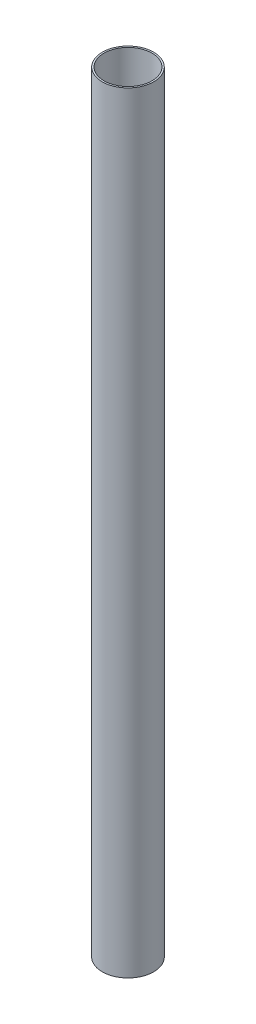
ISO-10303-21;
HEADER;
FILE_DESCRIPTION(('STEP AP214'),'2;1');
FILE_NAME('part.step','',(''),(''),'','','');
FILE_SCHEMA(('AUTOMOTIVE_DESIGN { 1 0 10303 214 1 1 1 1 }'));
ENDSEC;
DATA;
#1=APPLICATION_CONTEXT('core data for automotive mechanical design processes');
#2=APPLICATION_PROTOCOL_DEFINITION('international standard','automotive_design',2000,#1);
#3=PRODUCT_CONTEXT('',#1,'mechanical');
#4=PRODUCT('Part','Part','',(#3));
#5=PRODUCT_RELATED_PRODUCT_CATEGORY('part','',(#4));
#6=PRODUCT_DEFINITION_FORMATION('','',#4);
#7=PRODUCT_DEFINITION_CONTEXT('part definition',#1,'design');
#8=PRODUCT_DEFINITION('design','',#6,#7);
#9=PRODUCT_DEFINITION_SHAPE('','',#8);
#10=(LENGTH_UNIT() NAMED_UNIT(*) SI_UNIT(.MILLI.,.METRE.));
#11=(NAMED_UNIT(*) PLANE_ANGLE_UNIT() SI_UNIT($,.RADIAN.));
#12=(NAMED_UNIT(*) SI_UNIT($,.STERADIAN.) SOLID_ANGLE_UNIT());
#13=UNCERTAINTY_MEASURE_WITH_UNIT(LENGTH_MEASURE(1.E-05),#10,'distance_accuracy_value','');
#14=(GEOMETRIC_REPRESENTATION_CONTEXT(3) GLOBAL_UNCERTAINTY_ASSIGNED_CONTEXT((#13)) GLOBAL_UNIT_ASSIGNED_CONTEXT((#10,
#11,#12)) REPRESENTATION_CONTEXT('',''));
#15=CARTESIAN_POINT('',(0.,0.,0.));
#16=DIRECTION('',(0.,0.,1.));
#17=DIRECTION('',(1.,0.,0.));
#18=AXIS2_PLACEMENT_3D('',#15,#16,#17);
#19=CARTESIAN_POINT('',(0.,381.,0.));
#20=DIRECTION('',(0.,1.,0.));
#21=DIRECTION('',(0.,0.,1.));
#22=AXIS2_PLACEMENT_3D('',#19,#20,#21);
#23=PLANE('',#22);
#24=CARTESIAN_POINT('',(0.,381.,0.));
#25=DIRECTION('',(0.,1.,0.));
#26=DIRECTION('',(0.,0.,1.));
#27=AXIS2_PLACEMENT_3D('',#24,#25,#26);
#28=CIRCLE('',#27,12.7);
#29=CARTESIAN_POINT('',(0.,381.,12.7));
#30=VERTEX_POINT('',#29);
#31=EDGE_CURVE('E10',#30,#30,#28,.T.);
#32=ORIENTED_EDGE('',*,*,#31,.T.);
#33=EDGE_LOOP('',(#32));
#34=FACE_BOUND('',#33,.T.);
#35=CARTESIAN_POINT('',(0.,381.,0.));
#36=DIRECTION('',(0.,1.,0.));
#37=DIRECTION('',(0.,0.,1.));
#38=AXIS2_PLACEMENT_3D('',#35,#36,#37);
#39=CIRCLE('',#38,11.8745);
#40=CARTESIAN_POINT('',(0.,381.,11.8745));
#41=VERTEX_POINT('',#40);
#42=EDGE_CURVE('E42',#41,#41,#39,.T.);
#43=ORIENTED_EDGE('',*,*,#42,.F.);
#44=EDGE_LOOP('',(#43));
#45=FACE_BOUND('',#44,.T.);
#46=ADVANCED_FACE('F31',(#34,#45),#23,.T.);
#47=CARTESIAN_POINT('',(0.,0.,0.));
#48=DIRECTION('',(0.,1.,0.));
#49=DIRECTION('',(0.,0.,1.));
#50=AXIS2_PLACEMENT_3D('',#47,#48,#49);
#51=PLANE('',#50);
#52=CARTESIAN_POINT('',(0.,0.,0.));
#53=DIRECTION('',(0.,1.,0.));
#54=DIRECTION('',(0.,0.,1.));
#55=AXIS2_PLACEMENT_3D('',#52,#53,#54);
#56=CIRCLE('',#55,12.7);
#57=CARTESIAN_POINT('',(0.,0.,12.7));
#58=VERTEX_POINT('',#57);
#59=EDGE_CURVE('E35',#58,#58,#56,.T.);
#60=ORIENTED_EDGE('',*,*,#59,.F.);
#61=EDGE_LOOP('',(#60));
#62=FACE_BOUND('',#61,.T.);
#63=CARTESIAN_POINT('',(0.,0.,0.));
#64=DIRECTION('',(0.,1.,0.));
#65=DIRECTION('',(0.,0.,1.));
#66=AXIS2_PLACEMENT_3D('',#63,#64,#65);
#67=CIRCLE('',#66,11.8745);
#68=CARTESIAN_POINT('',(0.,0.,11.8745));
#69=VERTEX_POINT('',#68);
#70=EDGE_CURVE('E44',#69,#69,#67,.T.);
#71=ORIENTED_EDGE('',*,*,#70,.T.);
#72=EDGE_LOOP('',(#71));
#73=FACE_BOUND('',#72,.T.);
#74=ADVANCED_FACE('F54',(#62,#73),#51,.F.);
#75=CARTESIAN_POINT('',(0.,381.,0.));
#76=DIRECTION('',(0.,-1.,0.));
#77=DIRECTION('',(0.,0.,-1.));
#78=AXIS2_PLACEMENT_3D('',#75,#76,#77);
#79=CYLINDRICAL_SURFACE('',#78,12.7);
#80=ORIENTED_EDGE('',*,*,#31,.F.);
#81=EDGE_LOOP('',(#80));
#82=FACE_BOUND('',#81,.T.);
#83=ORIENTED_EDGE('',*,*,#59,.T.);
#84=EDGE_LOOP('',(#83));
#85=FACE_BOUND('',#84,.T.);
#86=ADVANCED_FACE('F33',(#82,#85),#79,.T.);
#87=CARTESIAN_POINT('',(0.,381.,0.));
#88=DIRECTION('',(0.,-1.,0.));
#89=DIRECTION('',(0.,0.,-1.));
#90=AXIS2_PLACEMENT_3D('',#87,#88,#89);
#91=CYLINDRICAL_SURFACE('',#90,11.8745);
#92=ORIENTED_EDGE('',*,*,#42,.T.);
#93=EDGE_LOOP('',(#92));
#94=FACE_BOUND('',#93,.T.);
#95=ORIENTED_EDGE('',*,*,#70,.F.);
#96=EDGE_LOOP('',(#95));
#97=FACE_BOUND('',#96,.T.);
#98=ADVANCED_FACE('F50',(#94,#97),#91,.F.);
#99=CLOSED_SHELL('',(#46,#74,#86,#98));
#100=MANIFOLD_SOLID_BREP('B2',#99);
#101=ADVANCED_BREP_SHAPE_REPRESENTATION('',(#18,#100),#14);
#102=SHAPE_DEFINITION_REPRESENTATION(#9,#101);
ENDSEC;
END-ISO-10303-21;
